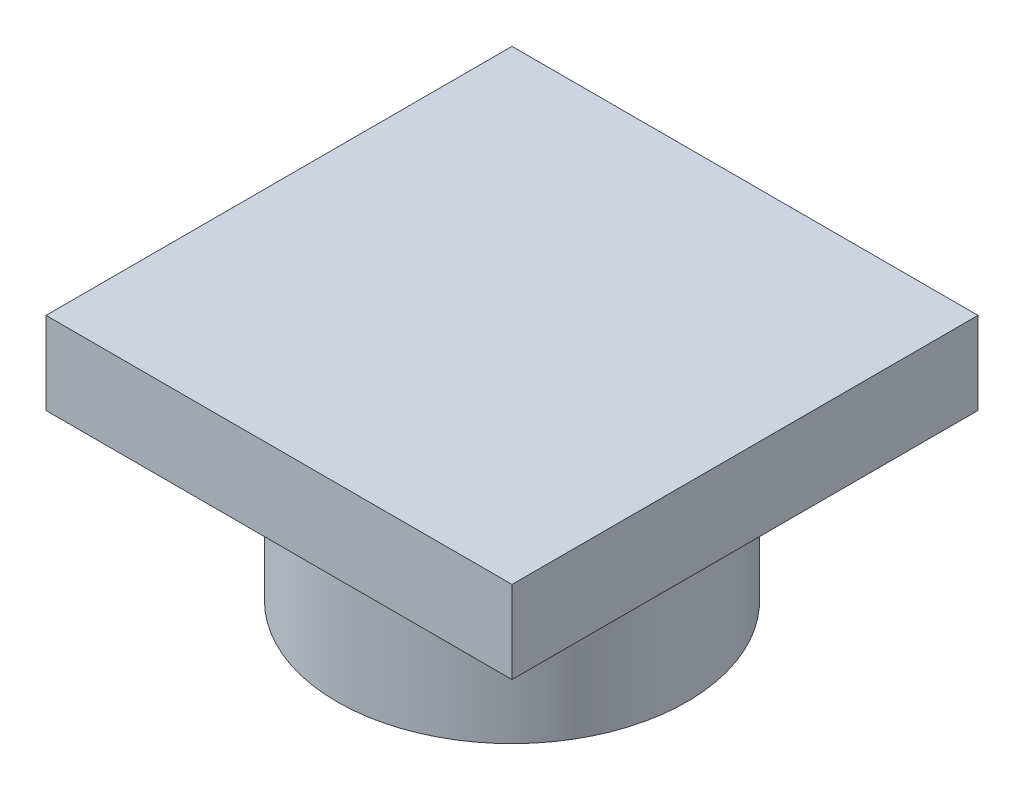
ISO-10303-21;
HEADER;
FILE_DESCRIPTION(('STEP AP214'),'2;1');
FILE_NAME('part.step','',(''),(''),'','','');
FILE_SCHEMA(('AUTOMOTIVE_DESIGN { 1 0 10303 214 1 1 1 1 }'));
ENDSEC;
DATA;
#1=APPLICATION_CONTEXT('core data for automotive mechanical design processes');
#2=APPLICATION_PROTOCOL_DEFINITION('international standard','automotive_design',2000,#1);
#3=PRODUCT_CONTEXT('',#1,'mechanical');
#4=PRODUCT('Part','Part','',(#3));
#5=PRODUCT_RELATED_PRODUCT_CATEGORY('part','',(#4));
#6=PRODUCT_DEFINITION_FORMATION('','',#4);
#7=PRODUCT_DEFINITION_CONTEXT('part definition',#1,'design');
#8=PRODUCT_DEFINITION('design','',#6,#7);
#9=PRODUCT_DEFINITION_SHAPE('','',#8);
#10=(LENGTH_UNIT() NAMED_UNIT(*) SI_UNIT(.MILLI.,.METRE.));
#11=(NAMED_UNIT(*) PLANE_ANGLE_UNIT() SI_UNIT($,.RADIAN.));
#12=(NAMED_UNIT(*) SI_UNIT($,.STERADIAN.) SOLID_ANGLE_UNIT());
#13=UNCERTAINTY_MEASURE_WITH_UNIT(LENGTH_MEASURE(1.E-05),#10,'distance_accuracy_value','');
#14=(GEOMETRIC_REPRESENTATION_CONTEXT(3) GLOBAL_UNCERTAINTY_ASSIGNED_CONTEXT((#13)) GLOBAL_UNIT_ASSIGNED_CONTEXT((#10,
#11,#12)) REPRESENTATION_CONTEXT('',''));
#15=CARTESIAN_POINT('',(0.,0.,0.));
#16=DIRECTION('',(0.,0.,1.));
#17=DIRECTION('',(1.,0.,0.));
#18=AXIS2_PLACEMENT_3D('',#15,#16,#17);
#19=CARTESIAN_POINT('',(0.,4.,0.));
#20=DIRECTION('',(0.,-1.,0.));
#21=DIRECTION('',(0.,0.,-1.));
#22=AXIS2_PLACEMENT_3D('',#19,#20,#21);
#23=CYLINDRICAL_SURFACE('',#22,4.25);
#24=CARTESIAN_POINT('',(0.,4.,0.));
#25=DIRECTION('',(0.,1.,0.));
#26=DIRECTION('',(0.,0.,1.));
#27=AXIS2_PLACEMENT_3D('',#24,#25,#26);
#28=CIRCLE('',#27,4.25);
#29=CARTESIAN_POINT('',(0.,4.,4.25));
#30=VERTEX_POINT('',#29);
#31=EDGE_CURVE('E11',#30,#30,#28,.T.);
#32=ORIENTED_EDGE('',*,*,#31,.F.);
#33=EDGE_LOOP('',(#32));
#34=FACE_BOUND('',#33,.T.);
#35=CARTESIAN_POINT('',(0.,0.,0.));
#36=DIRECTION('',(0.,1.,0.));
#37=DIRECTION('',(0.,0.,1.));
#38=AXIS2_PLACEMENT_3D('',#35,#36,#37);
#39=CIRCLE('',#38,4.25);
#40=CARTESIAN_POINT('',(0.,0.,4.25));
#41=VERTEX_POINT('',#40);
#42=EDGE_CURVE('E43',#41,#41,#39,.T.);
#43=ORIENTED_EDGE('',*,*,#42,.T.);
#44=EDGE_LOOP('',(#43));
#45=FACE_BOUND('',#44,.T.);
#46=ADVANCED_FACE('F40',(#34,#45),#23,.T.);
#47=CARTESIAN_POINT('',(0.,0.,0.));
#48=DIRECTION('',(0.,1.,0.));
#49=DIRECTION('',(0.,0.,1.));
#50=AXIS2_PLACEMENT_3D('',#47,#48,#49);
#51=PLANE('',#50);
#52=CARTESIAN_POINT('',(0.,0.,0.));
#53=DIRECTION('',(0.,-1.,0.));
#54=DIRECTION('',(0.,0.,-1.));
#55=AXIS2_PLACEMENT_3D('',#52,#53,#54);
#56=CIRCLE('',#55,4.1);
#57=CARTESIAN_POINT('',(0.,0.,-4.1));
#58=VERTEX_POINT('',#57);
#59=EDGE_CURVE('E173',#58,#58,#56,.T.);
#60=ORIENTED_EDGE('',*,*,#59,.F.);
#61=EDGE_LOOP('',(#60));
#62=FACE_BOUND('',#61,.T.);
#63=ORIENTED_EDGE('',*,*,#42,.F.);
#64=EDGE_LOOP('',(#63));
#65=FACE_BOUND('',#64,.T.);
#66=ADVANCED_FACE('F133',(#62,#65),#51,.F.);
#67=CARTESIAN_POINT('',(0.,6.,5.65685424949241));
#68=DIRECTION('',(0.,0.,-1.));
#69=DIRECTION('',(-1.,0.,0.));
#70=AXIS2_PLACEMENT_3D('',#67,#68,#69);
#71=PLANE('',#70);
#72=DIRECTION('',(1.,0.,0.));
#73=VECTOR('',#72,1.);
#74=CARTESIAN_POINT('',(0.,4.,5.65685424949241));
#75=LINE('',#74,#73);
#76=CARTESIAN_POINT('',(-5.65685424949235,4.,5.65685424949241));
#77=VERTEX_POINT('',#76);
#78=CARTESIAN_POINT('',(5.65685424949238,4.,5.65685424949241));
#79=VERTEX_POINT('',#78);
#80=EDGE_CURVE('E111',#77,#79,#75,.T.);
#81=ORIENTED_EDGE('',*,*,#80,.T.);
#82=DIRECTION('',(0.,-1.,0.));
#83=VECTOR('',#82,1.);
#84=CARTESIAN_POINT('',(5.65685424949238,6.,5.65685424949241));
#85=LINE('',#84,#83);
#86=CARTESIAN_POINT('',(5.65685424949238,6.,5.65685424949241));
#87=VERTEX_POINT('',#86);
#88=EDGE_CURVE('E97',#87,#79,#85,.T.);
#89=ORIENTED_EDGE('',*,*,#88,.F.);
#90=DIRECTION('',(1.,0.,0.));
#91=VECTOR('',#90,1.);
#92=CARTESIAN_POINT('',(0.,6.,5.65685424949241));
#93=LINE('',#92,#91);
#94=CARTESIAN_POINT('',(-5.65685424949235,6.,5.65685424949241));
#95=VERTEX_POINT('',#94);
#96=EDGE_CURVE('E81',#95,#87,#93,.T.);
#97=ORIENTED_EDGE('',*,*,#96,.F.);
#98=DIRECTION('',(0.,-1.,0.));
#99=VECTOR('',#98,1.);
#100=CARTESIAN_POINT('',(-5.65685424949235,6.,5.65685424949241));
#101=LINE('',#100,#99);
#102=EDGE_CURVE('E107',#95,#77,#101,.T.);
#103=ORIENTED_EDGE('',*,*,#102,.T.);
#104=EDGE_LOOP('',(#81,#89,#97,#103));
#105=FACE_BOUND('',#104,.T.);
#106=ADVANCED_FACE('F135',(#105),#71,.F.);
#107=CARTESIAN_POINT('',(5.65685424949238,6.,0.));
#108=DIRECTION('',(1.,0.,0.));
#109=DIRECTION('',(0.,0.,-1.));
#110=AXIS2_PLACEMENT_3D('',#107,#108,#109);
#111=PLANE('',#110);
#112=DIRECTION('',(0.,0.,1.));
#113=VECTOR('',#112,1.);
#114=CARTESIAN_POINT('',(5.65685424949238,4.,0.));
#115=LINE('',#114,#113);
#116=CARTESIAN_POINT('',(5.65685424949238,4.,-5.65685424949238));
#117=VERTEX_POINT('',#116);
#118=EDGE_CURVE('E91',#117,#79,#115,.T.);
#119=ORIENTED_EDGE('',*,*,#118,.F.);
#120=DIRECTION('',(0.,-1.,0.));
#121=VECTOR('',#120,1.);
#122=CARTESIAN_POINT('',(5.65685424949238,6.,-5.65685424949238));
#123=LINE('',#122,#121);
#124=CARTESIAN_POINT('',(5.65685424949238,6.,-5.65685424949238));
#125=VERTEX_POINT('',#124);
#126=EDGE_CURVE('E87',#125,#117,#123,.T.);
#127=ORIENTED_EDGE('',*,*,#126,.F.);
#128=DIRECTION('',(0.,0.,1.));
#129=VECTOR('',#128,1.);
#130=CARTESIAN_POINT('',(5.65685424949238,6.,0.));
#131=LINE('',#130,#129);
#132=EDGE_CURVE('E89',#125,#87,#131,.T.);
#133=ORIENTED_EDGE('',*,*,#132,.T.);
#134=ORIENTED_EDGE('',*,*,#88,.T.);
#135=EDGE_LOOP('',(#119,#127,#133,#134));
#136=FACE_BOUND('',#135,.T.);
#137=ADVANCED_FACE('F88',(#136),#111,.T.);
#138=CARTESIAN_POINT('',(0.,6.,-5.65685424949238));
#139=DIRECTION('',(0.,0.,-1.));
#140=DIRECTION('',(-1.,0.,0.));
#141=AXIS2_PLACEMENT_3D('',#138,#139,#140);
#142=PLANE('',#141);
#143=DIRECTION('',(1.,0.,0.));
#144=VECTOR('',#143,1.);
#145=CARTESIAN_POINT('',(0.,4.,-5.65685424949238));
#146=LINE('',#145,#144);
#147=CARTESIAN_POINT('',(-5.65685424949235,4.,-5.65685424949238));
#148=VERTEX_POINT('',#147);
#149=EDGE_CURVE('E118',#148,#117,#146,.T.);
#150=ORIENTED_EDGE('',*,*,#149,.F.);
#151=DIRECTION('',(0.,-1.,0.));
#152=VECTOR('',#151,1.);
#153=CARTESIAN_POINT('',(-5.65685424949235,6.,-5.65685424949238));
#154=LINE('',#153,#152);
#155=CARTESIAN_POINT('',(-5.65685424949235,6.,-5.65685424949238));
#156=VERTEX_POINT('',#155);
#157=EDGE_CURVE('E73',#156,#148,#154,.T.);
#158=ORIENTED_EDGE('',*,*,#157,.F.);
#159=DIRECTION('',(1.,0.,0.));
#160=VECTOR('',#159,1.);
#161=CARTESIAN_POINT('',(0.,6.,-5.65685424949238));
#162=LINE('',#161,#160);
#163=EDGE_CURVE('E100',#156,#125,#162,.T.);
#164=ORIENTED_EDGE('',*,*,#163,.T.);
#165=ORIENTED_EDGE('',*,*,#126,.T.);
#166=EDGE_LOOP('',(#150,#158,#164,#165));
#167=FACE_BOUND('',#166,.T.);
#168=ADVANCED_FACE('F103',(#167),#142,.T.);
#169=CARTESIAN_POINT('',(-5.65685424949235,6.,0.));
#170=DIRECTION('',(1.,0.,0.));
#171=DIRECTION('',(0.,0.,-1.));
#172=AXIS2_PLACEMENT_3D('',#169,#170,#171);
#173=PLANE('',#172);
#174=DIRECTION('',(0.,0.,1.));
#175=VECTOR('',#174,1.);
#176=CARTESIAN_POINT('',(-5.65685424949235,4.,0.));
#177=LINE('',#176,#175);
#178=EDGE_CURVE('E76',#148,#77,#177,.T.);
#179=ORIENTED_EDGE('',*,*,#178,.T.);
#180=ORIENTED_EDGE('',*,*,#102,.F.);
#181=DIRECTION('',(0.,0.,1.));
#182=VECTOR('',#181,1.);
#183=CARTESIAN_POINT('',(-5.65685424949235,6.,0.));
#184=LINE('',#183,#182);
#185=EDGE_CURVE('E57',#156,#95,#184,.T.);
#186=ORIENTED_EDGE('',*,*,#185,.F.);
#187=ORIENTED_EDGE('',*,*,#157,.T.);
#188=EDGE_LOOP('',(#179,#180,#186,#187));
#189=FACE_BOUND('',#188,.T.);
#190=ADVANCED_FACE('F152',(#189),#173,.F.);
#191=CARTESIAN_POINT('',(0.,6.,0.));
#192=DIRECTION('',(0.,1.,0.));
#193=DIRECTION('',(0.,0.,1.));
#194=AXIS2_PLACEMENT_3D('',#191,#192,#193);
#195=PLANE('',#194);
#196=ORIENTED_EDGE('',*,*,#96,.T.);
#197=ORIENTED_EDGE('',*,*,#132,.F.);
#198=ORIENTED_EDGE('',*,*,#163,.F.);
#199=ORIENTED_EDGE('',*,*,#185,.T.);
#200=EDGE_LOOP('',(#196,#197,#198,#199));
#201=FACE_BOUND('',#200,.T.);
#202=ADVANCED_FACE('F99',(#201),#195,.T.);
#203=CARTESIAN_POINT('',(0.,4.,0.));
#204=DIRECTION('',(0.,1.,0.));
#205=DIRECTION('',(0.,0.,1.));
#206=AXIS2_PLACEMENT_3D('',#203,#204,#205);
#207=PLANE('',#206);
#208=ORIENTED_EDGE('',*,*,#31,.T.);
#209=EDGE_LOOP('',(#208));
#210=FACE_BOUND('',#209,.T.);
#211=ORIENTED_EDGE('',*,*,#80,.F.);
#212=ORIENTED_EDGE('',*,*,#178,.F.);
#213=ORIENTED_EDGE('',*,*,#149,.T.);
#214=ORIENTED_EDGE('',*,*,#118,.T.);
#215=EDGE_LOOP('',(#211,#212,#213,#214));
#216=FACE_BOUND('',#215,.T.);
#217=ADVANCED_FACE('F155',(#210,#216),#207,.F.);
#218=CARTESIAN_POINT('',(0.,2.,0.));
#219=DIRECTION('',(0.,-1.,0.));
#220=DIRECTION('',(0.,0.,-1.));
#221=AXIS2_PLACEMENT_3D('',#218,#219,#220);
#222=CYLINDRICAL_SURFACE('',#221,4.1);
#223=CARTESIAN_POINT('',(0.,2.,0.));
#224=DIRECTION('',(0.,-1.,0.));
#225=DIRECTION('',(0.,0.,-1.));
#226=AXIS2_PLACEMENT_3D('',#223,#224,#225);
#227=CIRCLE('',#226,4.1);
#228=CARTESIAN_POINT('',(0.,2.,-4.1));
#229=VERTEX_POINT('',#228);
#230=EDGE_CURVE('E115',#229,#229,#227,.T.);
#231=ORIENTED_EDGE('',*,*,#230,.F.);
#232=EDGE_LOOP('',(#231));
#233=FACE_BOUND('',#232,.T.);
#234=ORIENTED_EDGE('',*,*,#59,.T.);
#235=EDGE_LOOP('',(#234));
#236=FACE_BOUND('',#235,.T.);
#237=ADVANCED_FACE('F158',(#233,#236),#222,.F.);
#238=CARTESIAN_POINT('',(0.,2.,0.));
#239=DIRECTION('',(0.,-1.,0.));
#240=DIRECTION('',(0.,0.,-1.));
#241=AXIS2_PLACEMENT_3D('',#238,#239,#240);
#242=PLANE('',#241);
#243=ORIENTED_EDGE('',*,*,#230,.T.);
#244=EDGE_LOOP('',(#243));
#245=FACE_BOUND('',#244,.T.);
#246=ADVANCED_FACE('F164',(#245),#242,.T.);
#247=CLOSED_SHELL('',(#46,#66,#106,#137,#168,#190,#202,#217,#237,#246));
#248=MANIFOLD_SOLID_BREP('B2',#247);
#249=ADVANCED_BREP_SHAPE_REPRESENTATION('',(#18,#248),#14);
#250=SHAPE_DEFINITION_REPRESENTATION(#9,#249);
ENDSEC;
END-ISO-10303-21;
